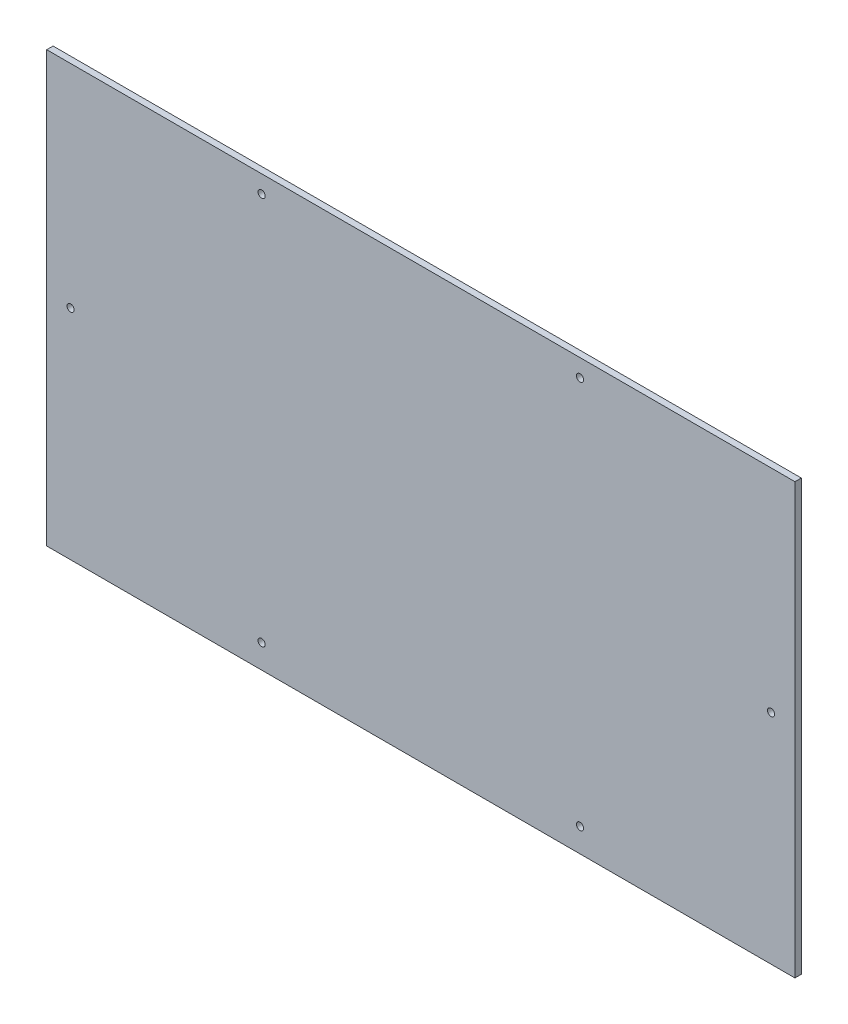
ISO-10303-21;
HEADER;
FILE_DESCRIPTION(('STEP AP214'),'2;1');
FILE_NAME('part.step','',(''),(''),'','','');
FILE_SCHEMA(('AUTOMOTIVE_DESIGN { 1 0 10303 214 1 1 1 1 }'));
ENDSEC;
DATA;
#1=APPLICATION_CONTEXT('core data for automotive mechanical design processes');
#2=APPLICATION_PROTOCOL_DEFINITION('international standard','automotive_design',2000,#1);
#3=PRODUCT_CONTEXT('',#1,'mechanical');
#4=PRODUCT('Part','Part','',(#3));
#5=PRODUCT_RELATED_PRODUCT_CATEGORY('part','',(#4));
#6=PRODUCT_DEFINITION_FORMATION('','',#4);
#7=PRODUCT_DEFINITION_CONTEXT('part definition',#1,'design');
#8=PRODUCT_DEFINITION('design','',#6,#7);
#9=PRODUCT_DEFINITION_SHAPE('','',#8);
#10=(LENGTH_UNIT() NAMED_UNIT(*) SI_UNIT(.MILLI.,.METRE.));
#11=(NAMED_UNIT(*) PLANE_ANGLE_UNIT() SI_UNIT($,.RADIAN.));
#12=(NAMED_UNIT(*) SI_UNIT($,.STERADIAN.) SOLID_ANGLE_UNIT());
#13=UNCERTAINTY_MEASURE_WITH_UNIT(LENGTH_MEASURE(1.E-05),#10,'distance_accuracy_value','');
#14=(GEOMETRIC_REPRESENTATION_CONTEXT(3) GLOBAL_UNCERTAINTY_ASSIGNED_CONTEXT((#13)) GLOBAL_UNIT_ASSIGNED_CONTEXT((#10,
#11,#12)) REPRESENTATION_CONTEXT('',''));
#15=CARTESIAN_POINT('',(0.,0.,0.));
#16=DIRECTION('',(0.,0.,1.));
#17=DIRECTION('',(1.,0.,0.));
#18=AXIS2_PLACEMENT_3D('',#15,#16,#17);
#19=CARTESIAN_POINT('',(-235.,0.,2.));
#20=DIRECTION('',(1.,0.,0.));
#21=DIRECTION('',(0.,1.,0.));
#22=AXIS2_PLACEMENT_3D('',#19,#20,#21);
#23=PLANE('',#22);
#24=DIRECTION('',(0.,-1.,0.));
#25=VECTOR('',#24,1.);
#26=CARTESIAN_POINT('',(-235.,0.,-2.));
#27=LINE('',#26,#25);
#28=CARTESIAN_POINT('',(-235.,0.,-2.));
#29=VERTEX_POINT('',#28);
#30=CARTESIAN_POINT('',(-235.,-270.,-2.));
#31=VERTEX_POINT('',#30);
#32=EDGE_CURVE('E99',#29,#31,#27,.T.);
#33=ORIENTED_EDGE('',*,*,#32,.T.);
#34=DIRECTION('',(0.,0.,-1.));
#35=VECTOR('',#34,1.);
#36=CARTESIAN_POINT('',(-235.,-270.,2.));
#37=LINE('',#36,#35);
#38=CARTESIAN_POINT('',(-235.,-270.,2.));
#39=VERTEX_POINT('',#38);
#40=EDGE_CURVE('E11',#39,#31,#37,.T.);
#41=ORIENTED_EDGE('',*,*,#40,.F.);
#42=DIRECTION('',(0.,-1.,0.));
#43=VECTOR('',#42,1.);
#44=CARTESIAN_POINT('',(-235.,0.,2.));
#45=LINE('',#44,#43);
#46=CARTESIAN_POINT('',(-235.,0.,2.));
#47=VERTEX_POINT('',#46);
#48=EDGE_CURVE('E87',#47,#39,#45,.T.);
#49=ORIENTED_EDGE('',*,*,#48,.F.);
#50=DIRECTION('',(0.,0.,-1.));
#51=VECTOR('',#50,1.);
#52=CARTESIAN_POINT('',(-235.,0.,2.));
#53=LINE('',#52,#51);
#54=EDGE_CURVE('E95',#47,#29,#53,.T.);
#55=ORIENTED_EDGE('',*,*,#54,.T.);
#56=EDGE_LOOP('',(#33,#41,#49,#55));
#57=FACE_BOUND('',#56,.T.);
#58=ADVANCED_FACE('F36',(#57),#23,.F.);
#59=CARTESIAN_POINT('',(-235.,-270.,2.));
#60=DIRECTION('',(0.,1.,0.));
#61=DIRECTION('',(0.,0.,1.));
#62=AXIS2_PLACEMENT_3D('',#59,#60,#61);
#63=PLANE('',#62);
#64=DIRECTION('',(1.,0.,0.));
#65=VECTOR('',#64,1.);
#66=CARTESIAN_POINT('',(-235.,-270.,-2.));
#67=LINE('',#66,#65);
#68=CARTESIAN_POINT('',(235.,-270.,-2.));
#69=VERTEX_POINT('',#68);
#70=EDGE_CURVE('E91',#31,#69,#67,.T.);
#71=ORIENTED_EDGE('',*,*,#70,.T.);
#72=DIRECTION('',(0.,0.,-1.));
#73=VECTOR('',#72,1.);
#74=CARTESIAN_POINT('',(235.,-270.,2.));
#75=LINE('',#74,#73);
#76=CARTESIAN_POINT('',(235.,-270.,2.));
#77=VERTEX_POINT('',#76);
#78=EDGE_CURVE('E44',#77,#69,#75,.T.);
#79=ORIENTED_EDGE('',*,*,#78,.F.);
#80=DIRECTION('',(1.,0.,0.));
#81=VECTOR('',#80,1.);
#82=CARTESIAN_POINT('',(-235.,-270.,2.));
#83=LINE('',#82,#81);
#84=EDGE_CURVE('E82',#39,#77,#83,.T.);
#85=ORIENTED_EDGE('',*,*,#84,.F.);
#86=ORIENTED_EDGE('',*,*,#40,.T.);
#87=EDGE_LOOP('',(#71,#79,#85,#86));
#88=FACE_BOUND('',#87,.T.);
#89=ADVANCED_FACE('F90',(#88),#63,.F.);
#90=CARTESIAN_POINT('',(235.,0.,2.));
#91=DIRECTION('',(-1.,0.,0.));
#92=DIRECTION('',(0.,-1.,0.));
#93=AXIS2_PLACEMENT_3D('',#90,#91,#92);
#94=PLANE('',#93);
#95=DIRECTION('',(0.,1.,0.));
#96=VECTOR('',#95,1.);
#97=CARTESIAN_POINT('',(235.,0.,-2.));
#98=LINE('',#97,#96);
#99=CARTESIAN_POINT('',(235.,0.,-2.));
#100=VERTEX_POINT('',#99);
#101=EDGE_CURVE('E69',#69,#100,#98,.T.);
#102=ORIENTED_EDGE('',*,*,#101,.T.);
#103=DIRECTION('',(0.,0.,-1.));
#104=VECTOR('',#103,1.);
#105=CARTESIAN_POINT('',(235.,0.,2.));
#106=LINE('',#105,#104);
#107=CARTESIAN_POINT('',(235.,0.,2.));
#108=VERTEX_POINT('',#107);
#109=EDGE_CURVE('E92',#108,#100,#106,.T.);
#110=ORIENTED_EDGE('',*,*,#109,.F.);
#111=DIRECTION('',(0.,1.,0.));
#112=VECTOR('',#111,1.);
#113=CARTESIAN_POINT('',(235.,0.,2.));
#114=LINE('',#113,#112);
#115=EDGE_CURVE('E85',#77,#108,#114,.T.);
#116=ORIENTED_EDGE('',*,*,#115,.F.);
#117=ORIENTED_EDGE('',*,*,#78,.T.);
#118=EDGE_LOOP('',(#102,#110,#116,#117));
#119=FACE_BOUND('',#118,.T.);
#120=ADVANCED_FACE('F93',(#119),#94,.F.);
#121=CARTESIAN_POINT('',(-235.,0.,2.));
#122=DIRECTION('',(0.,-1.,0.));
#123=DIRECTION('',(0.,0.,-1.));
#124=AXIS2_PLACEMENT_3D('',#121,#122,#123);
#125=PLANE('',#124);
#126=DIRECTION('',(-1.,0.,0.));
#127=VECTOR('',#126,1.);
#128=CARTESIAN_POINT('',(-235.,0.,-2.));
#129=LINE('',#128,#127);
#130=EDGE_CURVE('E75',#100,#29,#129,.T.);
#131=ORIENTED_EDGE('',*,*,#130,.T.);
#132=ORIENTED_EDGE('',*,*,#54,.F.);
#133=DIRECTION('',(-1.,0.,0.));
#134=VECTOR('',#133,1.);
#135=CARTESIAN_POINT('',(-235.,0.,2.));
#136=LINE('',#135,#134);
#137=EDGE_CURVE('E52',#108,#47,#136,.T.);
#138=ORIENTED_EDGE('',*,*,#137,.F.);
#139=ORIENTED_EDGE('',*,*,#109,.T.);
#140=EDGE_LOOP('',(#131,#132,#138,#139));
#141=FACE_BOUND('',#140,.T.);
#142=ADVANCED_FACE('F107',(#141),#125,.F.);
#143=CARTESIAN_POINT('',(0.,0.,2.));
#144=DIRECTION('',(0.,0.,1.));
#145=DIRECTION('',(1.,0.,0.));
#146=AXIS2_PLACEMENT_3D('',#143,#144,#145);
#147=PLANE('',#146);
#148=CARTESIAN_POINT('',(100.,-11.,2.));
#149=DIRECTION('',(0.,0.,1.));
#150=DIRECTION('',(-1.,0.,0.));
#151=AXIS2_PLACEMENT_3D('',#148,#149,#150);
#152=CIRCLE('',#151,2.25);
#153=CARTESIAN_POINT('',(97.75,-11.,2.));
#154=VERTEX_POINT('',#153);
#155=EDGE_CURVE('E143',#154,#154,#152,.T.);
#156=ORIENTED_EDGE('',*,*,#155,.F.);
#157=EDGE_LOOP('',(#156));
#158=FACE_BOUND('',#157,.T.);
#159=CARTESIAN_POINT('',(100.,-255.,2.));
#160=DIRECTION('',(0.,0.,1.));
#161=DIRECTION('',(-1.,0.,0.));
#162=AXIS2_PLACEMENT_3D('',#159,#160,#161);
#163=CIRCLE('',#162,2.25);
#164=CARTESIAN_POINT('',(97.75,-255.,2.));
#165=VERTEX_POINT('',#164);
#166=EDGE_CURVE('E137',#165,#165,#163,.T.);
#167=ORIENTED_EDGE('',*,*,#166,.F.);
#168=EDGE_LOOP('',(#167));
#169=FACE_BOUND('',#168,.T.);
#170=CARTESIAN_POINT('',(220.,-133.,2.));
#171=DIRECTION('',(0.,0.,1.));
#172=DIRECTION('',(-1.,0.,0.));
#173=AXIS2_PLACEMENT_3D('',#170,#171,#172);
#174=CIRCLE('',#173,2.25000000000001);
#175=CARTESIAN_POINT('',(217.75,-133.,2.));
#176=VERTEX_POINT('',#175);
#177=EDGE_CURVE('E131',#176,#176,#174,.T.);
#178=ORIENTED_EDGE('',*,*,#177,.F.);
#179=EDGE_LOOP('',(#178));
#180=FACE_BOUND('',#179,.T.);
#181=CARTESIAN_POINT('',(-100.,-255.,2.));
#182=DIRECTION('',(0.,0.,1.));
#183=DIRECTION('',(1.,0.,0.));
#184=AXIS2_PLACEMENT_3D('',#181,#182,#183);
#185=CIRCLE('',#184,2.25);
#186=CARTESIAN_POINT('',(-97.75,-255.,2.));
#187=VERTEX_POINT('',#186);
#188=EDGE_CURVE('E125',#187,#187,#185,.T.);
#189=ORIENTED_EDGE('',*,*,#188,.F.);
#190=EDGE_LOOP('',(#189));
#191=FACE_BOUND('',#190,.T.);
#192=CARTESIAN_POINT('',(-100.,-11.,2.));
#193=DIRECTION('',(0.,0.,1.));
#194=DIRECTION('',(1.,0.,0.));
#195=AXIS2_PLACEMENT_3D('',#192,#193,#194);
#196=CIRCLE('',#195,2.25);
#197=CARTESIAN_POINT('',(-97.75,-11.,2.));
#198=VERTEX_POINT('',#197);
#199=EDGE_CURVE('E119',#198,#198,#196,.T.);
#200=ORIENTED_EDGE('',*,*,#199,.F.);
#201=EDGE_LOOP('',(#200));
#202=FACE_BOUND('',#201,.T.);
#203=CARTESIAN_POINT('',(-220.,-133.,2.));
#204=DIRECTION('',(0.,0.,1.));
#205=DIRECTION('',(1.,0.,0.));
#206=AXIS2_PLACEMENT_3D('',#203,#204,#205);
#207=CIRCLE('',#206,2.25000000000001);
#208=CARTESIAN_POINT('',(-217.75,-133.,2.));
#209=VERTEX_POINT('',#208);
#210=EDGE_CURVE('E113',#209,#209,#207,.T.);
#211=ORIENTED_EDGE('',*,*,#210,.F.);
#212=EDGE_LOOP('',(#211));
#213=FACE_BOUND('',#212,.T.);
#214=ORIENTED_EDGE('',*,*,#48,.T.);
#215=ORIENTED_EDGE('',*,*,#84,.T.);
#216=ORIENTED_EDGE('',*,*,#115,.T.);
#217=ORIENTED_EDGE('',*,*,#137,.T.);
#218=EDGE_LOOP('',(#214,#215,#216,#217));
#219=FACE_BOUND('',#218,.T.);
#220=ADVANCED_FACE('F83',(#158,#169,#180,#191,#202,#213,#219),#147,.T.);
#221=CARTESIAN_POINT('',(0.,0.,-2.));
#222=DIRECTION('',(0.,0.,1.));
#223=DIRECTION('',(1.,0.,0.));
#224=AXIS2_PLACEMENT_3D('',#221,#222,#223);
#225=PLANE('',#224);
#226=CARTESIAN_POINT('',(100.,-11.,-2.));
#227=DIRECTION('',(0.,0.,1.));
#228=DIRECTION('',(-1.,0.,0.));
#229=AXIS2_PLACEMENT_3D('',#226,#227,#228);
#230=CIRCLE('',#229,2.25);
#231=CARTESIAN_POINT('',(97.75,-11.,-2.));
#232=VERTEX_POINT('',#231);
#233=EDGE_CURVE('E140',#232,#232,#230,.T.);
#234=ORIENTED_EDGE('',*,*,#233,.T.);
#235=EDGE_LOOP('',(#234));
#236=FACE_BOUND('',#235,.T.);
#237=CARTESIAN_POINT('',(100.,-255.,-2.));
#238=DIRECTION('',(0.,0.,1.));
#239=DIRECTION('',(-1.,0.,0.));
#240=AXIS2_PLACEMENT_3D('',#237,#238,#239);
#241=CIRCLE('',#240,2.25);
#242=CARTESIAN_POINT('',(97.75,-255.,-2.));
#243=VERTEX_POINT('',#242);
#244=EDGE_CURVE('E134',#243,#243,#241,.T.);
#245=ORIENTED_EDGE('',*,*,#244,.T.);
#246=EDGE_LOOP('',(#245));
#247=FACE_BOUND('',#246,.T.);
#248=CARTESIAN_POINT('',(220.,-133.,-2.));
#249=DIRECTION('',(0.,0.,1.));
#250=DIRECTION('',(-1.,0.,0.));
#251=AXIS2_PLACEMENT_3D('',#248,#249,#250);
#252=CIRCLE('',#251,2.25000000000001);
#253=CARTESIAN_POINT('',(217.75,-133.,-2.));
#254=VERTEX_POINT('',#253);
#255=EDGE_CURVE('E128',#254,#254,#252,.T.);
#256=ORIENTED_EDGE('',*,*,#255,.T.);
#257=EDGE_LOOP('',(#256));
#258=FACE_BOUND('',#257,.T.);
#259=CARTESIAN_POINT('',(-100.,-255.,-2.));
#260=DIRECTION('',(0.,0.,1.));
#261=DIRECTION('',(1.,0.,0.));
#262=AXIS2_PLACEMENT_3D('',#259,#260,#261);
#263=CIRCLE('',#262,2.25);
#264=CARTESIAN_POINT('',(-97.75,-255.,-2.));
#265=VERTEX_POINT('',#264);
#266=EDGE_CURVE('E122',#265,#265,#263,.T.);
#267=ORIENTED_EDGE('',*,*,#266,.T.);
#268=EDGE_LOOP('',(#267));
#269=FACE_BOUND('',#268,.T.);
#270=CARTESIAN_POINT('',(-100.,-11.,-2.));
#271=DIRECTION('',(0.,0.,1.));
#272=DIRECTION('',(1.,0.,0.));
#273=AXIS2_PLACEMENT_3D('',#270,#271,#272);
#274=CIRCLE('',#273,2.25);
#275=CARTESIAN_POINT('',(-97.75,-11.,-2.));
#276=VERTEX_POINT('',#275);
#277=EDGE_CURVE('E116',#276,#276,#274,.T.);
#278=ORIENTED_EDGE('',*,*,#277,.T.);
#279=EDGE_LOOP('',(#278));
#280=FACE_BOUND('',#279,.T.);
#281=CARTESIAN_POINT('',(-220.,-133.,-2.));
#282=DIRECTION('',(0.,0.,1.));
#283=DIRECTION('',(1.,0.,0.));
#284=AXIS2_PLACEMENT_3D('',#281,#282,#283);
#285=CIRCLE('',#284,2.25000000000001);
#286=CARTESIAN_POINT('',(-217.75,-133.,-2.));
#287=VERTEX_POINT('',#286);
#288=EDGE_CURVE('E102',#287,#287,#285,.T.);
#289=ORIENTED_EDGE('',*,*,#288,.T.);
#290=EDGE_LOOP('',(#289));
#291=FACE_BOUND('',#290,.T.);
#292=ORIENTED_EDGE('',*,*,#32,.F.);
#293=ORIENTED_EDGE('',*,*,#130,.F.);
#294=ORIENTED_EDGE('',*,*,#101,.F.);
#295=ORIENTED_EDGE('',*,*,#70,.F.);
#296=EDGE_LOOP('',(#292,#293,#294,#295));
#297=FACE_BOUND('',#296,.T.);
#298=ADVANCED_FACE('F110',(#236,#247,#258,#269,#280,#291,#297),#225,.F.);
#299=CARTESIAN_POINT('',(-220.,-133.,-2.));
#300=DIRECTION('',(0.,0.,1.));
#301=DIRECTION('',(1.,0.,0.));
#302=AXIS2_PLACEMENT_3D('',#299,#300,#301);
#303=CYLINDRICAL_SURFACE('',#302,2.25000000000001);
#304=ORIENTED_EDGE('',*,*,#288,.F.);
#305=EDGE_LOOP('',(#304));
#306=FACE_BOUND('',#305,.T.);
#307=ORIENTED_EDGE('',*,*,#210,.T.);
#308=EDGE_LOOP('',(#307));
#309=FACE_BOUND('',#308,.T.);
#310=ADVANCED_FACE('F171',(#306,#309),#303,.F.);
#311=CARTESIAN_POINT('',(-100.,-11.,-2.));
#312=DIRECTION('',(0.,0.,1.));
#313=DIRECTION('',(1.,0.,0.));
#314=AXIS2_PLACEMENT_3D('',#311,#312,#313);
#315=CYLINDRICAL_SURFACE('',#314,2.25);
#316=ORIENTED_EDGE('',*,*,#277,.F.);
#317=EDGE_LOOP('',(#316));
#318=FACE_BOUND('',#317,.T.);
#319=ORIENTED_EDGE('',*,*,#199,.T.);
#320=EDGE_LOOP('',(#319));
#321=FACE_BOUND('',#320,.T.);
#322=ADVANCED_FACE('F173',(#318,#321),#315,.F.);
#323=CARTESIAN_POINT('',(-100.,-255.,-2.));
#324=DIRECTION('',(0.,0.,1.));
#325=DIRECTION('',(1.,0.,0.));
#326=AXIS2_PLACEMENT_3D('',#323,#324,#325);
#327=CYLINDRICAL_SURFACE('',#326,2.25);
#328=ORIENTED_EDGE('',*,*,#266,.F.);
#329=EDGE_LOOP('',(#328));
#330=FACE_BOUND('',#329,.T.);
#331=ORIENTED_EDGE('',*,*,#188,.T.);
#332=EDGE_LOOP('',(#331));
#333=FACE_BOUND('',#332,.T.);
#334=ADVANCED_FACE('F180',(#330,#333),#327,.F.);
#335=CARTESIAN_POINT('',(220.,-133.,-2.));
#336=DIRECTION('',(0.,0.,1.));
#337=DIRECTION('',(1.,0.,0.));
#338=AXIS2_PLACEMENT_3D('',#335,#336,#337);
#339=CYLINDRICAL_SURFACE('',#338,2.25000000000001);
#340=ORIENTED_EDGE('',*,*,#255,.F.);
#341=EDGE_LOOP('',(#340));
#342=FACE_BOUND('',#341,.T.);
#343=ORIENTED_EDGE('',*,*,#177,.T.);
#344=EDGE_LOOP('',(#343));
#345=FACE_BOUND('',#344,.T.);
#346=ADVANCED_FACE('F226',(#342,#345),#339,.F.);
#347=CARTESIAN_POINT('',(100.,-255.,-2.));
#348=DIRECTION('',(0.,0.,1.));
#349=DIRECTION('',(1.,0.,0.));
#350=AXIS2_PLACEMENT_3D('',#347,#348,#349);
#351=CYLINDRICAL_SURFACE('',#350,2.25);
#352=ORIENTED_EDGE('',*,*,#244,.F.);
#353=EDGE_LOOP('',(#352));
#354=FACE_BOUND('',#353,.T.);
#355=ORIENTED_EDGE('',*,*,#166,.T.);
#356=EDGE_LOOP('',(#355));
#357=FACE_BOUND('',#356,.T.);
#358=ADVANCED_FACE('F154',(#354,#357),#351,.F.);
#359=CARTESIAN_POINT('',(100.,-11.,-2.));
#360=DIRECTION('',(0.,0.,1.));
#361=DIRECTION('',(1.,0.,0.));
#362=AXIS2_PLACEMENT_3D('',#359,#360,#361);
#363=CYLINDRICAL_SURFACE('',#362,2.25);
#364=ORIENTED_EDGE('',*,*,#233,.F.);
#365=EDGE_LOOP('',(#364));
#366=FACE_BOUND('',#365,.T.);
#367=ORIENTED_EDGE('',*,*,#155,.T.);
#368=EDGE_LOOP('',(#367));
#369=FACE_BOUND('',#368,.T.);
#370=ADVANCED_FACE('F151',(#366,#369),#363,.F.);
#371=CLOSED_SHELL('',(#58,#89,#120,#142,#220,#298,#310,#322,#334,#346,#358,#370));
#372=MANIFOLD_SOLID_BREP('B2',#371);
#373=ADVANCED_BREP_SHAPE_REPRESENTATION('',(#18,#372),#14);
#374=SHAPE_DEFINITION_REPRESENTATION(#9,#373);
ENDSEC;
END-ISO-10303-21;
